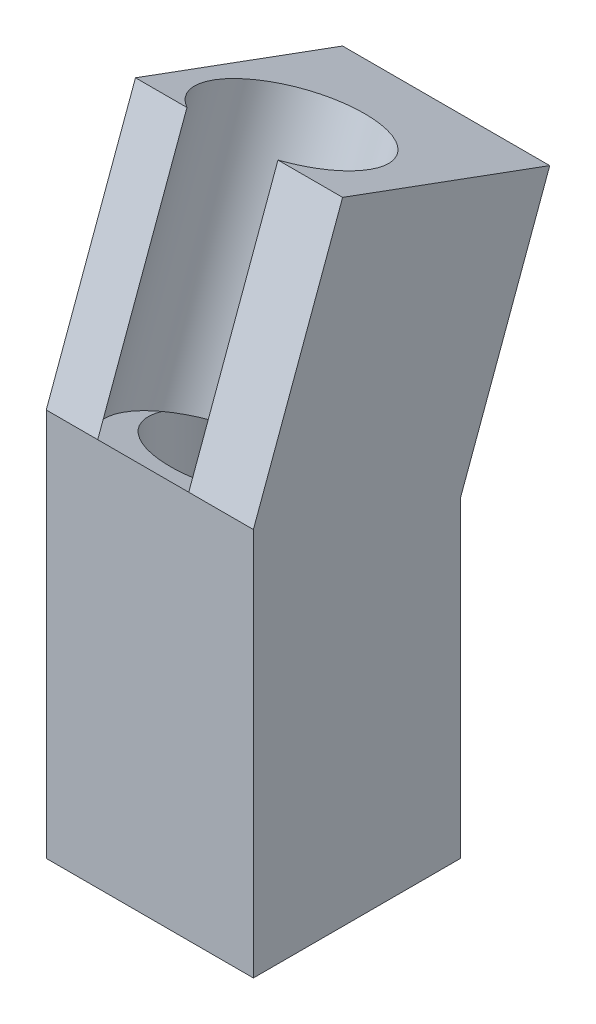
ISO-10303-21;
HEADER;
FILE_DESCRIPTION(('STEP AP214'),'2;1');
FILE_NAME('part.step','',(''),(''),'','','');
FILE_SCHEMA(('AUTOMOTIVE_DESIGN { 1 0 10303 214 1 1 1 1 }'));
ENDSEC;
DATA;
#1=APPLICATION_CONTEXT('core data for automotive mechanical design processes');
#2=APPLICATION_PROTOCOL_DEFINITION('international standard','automotive_design',2000,#1);
#3=PRODUCT_CONTEXT('',#1,'mechanical');
#4=PRODUCT('Part','Part','',(#3));
#5=PRODUCT_RELATED_PRODUCT_CATEGORY('part','',(#4));
#6=PRODUCT_DEFINITION_FORMATION('','',#4);
#7=PRODUCT_DEFINITION_CONTEXT('part definition',#1,'design');
#8=PRODUCT_DEFINITION('design','',#6,#7);
#9=PRODUCT_DEFINITION_SHAPE('','',#8);
#10=(LENGTH_UNIT() NAMED_UNIT(*) SI_UNIT(.MILLI.,.METRE.));
#11=(NAMED_UNIT(*) PLANE_ANGLE_UNIT() SI_UNIT($,.RADIAN.));
#12=(NAMED_UNIT(*) SI_UNIT($,.STERADIAN.) SOLID_ANGLE_UNIT());
#13=UNCERTAINTY_MEASURE_WITH_UNIT(LENGTH_MEASURE(1.E-05),#10,'distance_accuracy_value','');
#14=(GEOMETRIC_REPRESENTATION_CONTEXT(3) GLOBAL_UNCERTAINTY_ASSIGNED_CONTEXT((#13)) GLOBAL_UNIT_ASSIGNED_CONTEXT((#10,
#11,#12)) REPRESENTATION_CONTEXT('',''));
#15=CARTESIAN_POINT('',(0.,0.,0.));
#16=DIRECTION('',(0.,0.,1.));
#17=DIRECTION('',(1.,0.,0.));
#18=AXIS2_PLACEMENT_3D('',#15,#16,#17);
#19=CARTESIAN_POINT('',(0.,24.3874119678027,-3.44622932300727));
#20=DIRECTION('',(0.,-0.344622932300726,-0.938741196780268));
#21=DIRECTION('',(0.,0.938741196780268,-0.344622932300726));
#22=AXIS2_PLACEMENT_3D('',#19,#20,#21);
#23=PLANE('',#22);
#24=DIRECTION('',(1.,0.,0.));
#25=VECTOR('',#24,1.);
#26=CARTESIAN_POINT('',(0.,15.,0.));
#27=LINE('',#26,#25);
#28=CARTESIAN_POINT('',(0.,15.,0.));
#29=VERTEX_POINT('',#28);
#30=CARTESIAN_POINT('',(1.98807946303444,15.,0.));
#31=VERTEX_POINT('',#30);
#32=EDGE_CURVE('E116',#29,#31,#27,.T.);
#33=ORIENTED_EDGE('',*,*,#32,.T.);
#34=DIRECTION('',(0.,0.938741196780268,-0.344622932300726));
#35=VECTOR('',#34,1.);
#36=CARTESIAN_POINT('',(1.98807946303444,15.,0.));
#37=LINE('',#36,#35);
#38=CARTESIAN_POINT('',(1.98807946303444,24.3874119678027,-3.44622932300727));
#39=VERTEX_POINT('',#38);
#40=EDGE_CURVE('E129',#31,#39,#37,.T.);
#41=ORIENTED_EDGE('',*,*,#40,.T.);
#42=DIRECTION('',(1.,0.,0.));
#43=VECTOR('',#42,1.);
#44=CARTESIAN_POINT('',(0.,24.3874119678027,-3.44622932300727));
#45=LINE('',#44,#43);
#46=CARTESIAN_POINT('',(0.,24.3874119678027,-3.44622932300727));
#47=VERTEX_POINT('',#46);
#48=EDGE_CURVE('E188',#47,#39,#45,.T.);
#49=ORIENTED_EDGE('',*,*,#48,.F.);
#50=DIRECTION('',(0.,-0.938741196780268,0.344622932300726));
#51=VECTOR('',#50,1.);
#52=CARTESIAN_POINT('',(0.,24.3874119678027,-3.44622932300727));
#53=LINE('',#52,#51);
#54=EDGE_CURVE('E176',#47,#29,#53,.T.);
#55=ORIENTED_EDGE('',*,*,#54,.T.);
#56=EDGE_LOOP('',(#33,#41,#49,#55));
#57=FACE_BOUND('',#56,.T.);
#58=ADVANCED_FACE('F37',(#57),#23,.F.);
#59=CARTESIAN_POINT('',(0.,0.,0.));
#60=DIRECTION('',(0.,-1.,0.));
#61=DIRECTION('',(0.,0.,-1.));
#62=AXIS2_PLACEMENT_3D('',#59,#60,#61);
#63=PLANE('',#62);
#64=DIRECTION('',(0.,0.,1.));
#65=VECTOR('',#64,1.);
#66=CARTESIAN_POINT('',(0.,0.,0.));
#67=LINE('',#66,#65);
#68=CARTESIAN_POINT('',(0.,0.,-8.));
#69=VERTEX_POINT('',#68);
#70=CARTESIAN_POINT('',(0.,0.,0.));
#71=VERTEX_POINT('',#70);
#72=EDGE_CURVE('E165',#69,#71,#67,.T.);
#73=ORIENTED_EDGE('',*,*,#72,.F.);
#74=DIRECTION('',(-1.,0.,0.));
#75=VECTOR('',#74,1.);
#76=CARTESIAN_POINT('',(0.,0.,-8.));
#77=LINE('',#76,#75);
#78=CARTESIAN_POINT('',(8.,0.,-8.));
#79=VERTEX_POINT('',#78);
#80=EDGE_CURVE('E134',#79,#69,#77,.T.);
#81=ORIENTED_EDGE('',*,*,#80,.F.);
#82=DIRECTION('',(0.,0.,-1.));
#83=VECTOR('',#82,1.);
#84=CARTESIAN_POINT('',(8.,0.,0.));
#85=LINE('',#84,#83);
#86=CARTESIAN_POINT('',(8.,0.,0.));
#87=VERTEX_POINT('',#86);
#88=EDGE_CURVE('E136',#87,#79,#85,.T.);
#89=ORIENTED_EDGE('',*,*,#88,.F.);
#90=DIRECTION('',(1.,0.,0.));
#91=VECTOR('',#90,1.);
#92=CARTESIAN_POINT('',(0.,0.,0.));
#93=LINE('',#92,#91);
#94=EDGE_CURVE('E164',#71,#87,#93,.T.);
#95=ORIENTED_EDGE('',*,*,#94,.F.);
#96=EDGE_LOOP('',(#73,#81,#89,#95));
#97=FACE_BOUND('',#96,.T.);
#98=CARTESIAN_POINT('',(3.99556486753257,0.,-3.79143326371917));
#99=DIRECTION('',(0.,1.,0.));
#100=DIRECTION('',(0.,0.,1.));
#101=AXIS2_PLACEMENT_3D('',#98,#99,#100);
#102=CIRCLE('',#101,3.);
#103=CARTESIAN_POINT('',(3.99556486753257,0.,-0.791433263719172));
#104=VERTEX_POINT('',#103);
#105=EDGE_CURVE('E167',#104,#104,#102,.T.);
#106=ORIENTED_EDGE('',*,*,#105,.T.);
#107=EDGE_LOOP('',(#106));
#108=FACE_BOUND('',#107,.T.);
#109=ADVANCED_FACE('F162',(#97,#108),#63,.T.);
#110=CARTESIAN_POINT('',(0.,15.,0.));
#111=DIRECTION('',(1.,0.,0.));
#112=DIRECTION('',(0.,0.,-1.));
#113=AXIS2_PLACEMENT_3D('',#110,#111,#112);
#114=PLANE('',#113);
#115=DIRECTION('',(0.,-1.,0.));
#116=VECTOR('',#115,1.);
#117=CARTESIAN_POINT('',(0.,15.,0.));
#118=LINE('',#117,#116);
#119=EDGE_CURVE('E11',#29,#71,#118,.T.);
#120=ORIENTED_EDGE('',*,*,#119,.F.);
#121=ORIENTED_EDGE('',*,*,#54,.F.);
#122=DIRECTION('',(0.,0.344622932300726,0.938741196780268));
#123=VECTOR('',#122,1.);
#124=CARTESIAN_POINT('',(0.,21.4505178932038,-11.4462293230073));
#125=LINE('',#124,#123);
#126=CARTESIAN_POINT('',(0.,21.4505178932038,-11.4462293230073));
#127=VERTEX_POINT('',#126);
#128=EDGE_CURVE('E191',#127,#47,#125,.T.);
#129=ORIENTED_EDGE('',*,*,#128,.F.);
#130=DIRECTION('',(0.,-0.938741196780268,0.344622932300726));
#131=VECTOR('',#130,1.);
#132=CARTESIAN_POINT('',(0.,21.4505178932038,-11.4462293230073));
#133=LINE('',#132,#131);
#134=CARTESIAN_POINT('',(0.,12.0631059254011,-8.));
#135=VERTEX_POINT('',#134);
#136=EDGE_CURVE('E182',#127,#135,#133,.T.);
#137=ORIENTED_EDGE('',*,*,#136,.T.);
#138=DIRECTION('',(0.,-1.,0.));
#139=VECTOR('',#138,1.);
#140=CARTESIAN_POINT('',(0.,15.,-8.));
#141=LINE('',#140,#139);
#142=EDGE_CURVE('E140',#135,#69,#141,.T.);
#143=ORIENTED_EDGE('',*,*,#142,.T.);
#144=ORIENTED_EDGE('',*,*,#72,.T.);
#145=EDGE_LOOP('',(#120,#121,#129,#137,#143,#144));
#146=FACE_BOUND('',#145,.T.);
#147=ADVANCED_FACE('F39',(#146),#114,.F.);
#148=CARTESIAN_POINT('',(0.,15.,0.));
#149=DIRECTION('',(0.,0.,-1.));
#150=DIRECTION('',(-1.,0.,0.));
#151=AXIS2_PLACEMENT_3D('',#148,#149,#150);
#152=PLANE('',#151);
#153=ORIENTED_EDGE('',*,*,#94,.T.);
#154=DIRECTION('',(0.,-1.,0.));
#155=VECTOR('',#154,1.);
#156=CARTESIAN_POINT('',(8.,15.,0.));
#157=LINE('',#156,#155);
#158=CARTESIAN_POINT('',(8.,15.,0.));
#159=VERTEX_POINT('',#158);
#160=EDGE_CURVE('E46',#159,#87,#157,.T.);
#161=ORIENTED_EDGE('',*,*,#160,.F.);
#162=CARTESIAN_POINT('',(5.5029776175875,15.,0.));
#163=VERTEX_POINT('',#162);
#164=EDGE_CURVE('E117',#163,#159,#27,.T.);
#165=ORIENTED_EDGE('',*,*,#164,.F.);
#166=EDGE_CURVE('E109',#31,#163,#27,.T.);
#167=ORIENTED_EDGE('',*,*,#166,.F.);
#168=ORIENTED_EDGE('',*,*,#32,.F.);
#169=ORIENTED_EDGE('',*,*,#119,.T.);
#170=EDGE_LOOP('',(#153,#161,#165,#167,#168,#169));
#171=FACE_BOUND('',#170,.T.);
#172=ADVANCED_FACE('F131',(#171),#152,.F.);
#173=CARTESIAN_POINT('',(8.,15.,0.));
#174=DIRECTION('',(-1.,0.,0.));
#175=DIRECTION('',(0.,0.,1.));
#176=AXIS2_PLACEMENT_3D('',#173,#174,#175);
#177=PLANE('',#176);
#178=DIRECTION('',(0.,-1.,0.));
#179=VECTOR('',#178,1.);
#180=CARTESIAN_POINT('',(8.,15.,-8.));
#181=LINE('',#180,#179);
#182=CARTESIAN_POINT('',(8.,12.0631059254011,-8.));
#183=VERTEX_POINT('',#182);
#184=EDGE_CURVE('E144',#183,#79,#181,.T.);
#185=ORIENTED_EDGE('',*,*,#184,.F.);
#186=DIRECTION('',(0.,-0.938741196780268,0.344622932300726));
#187=VECTOR('',#186,1.);
#188=CARTESIAN_POINT('',(8.,21.4505178932038,-11.4462293230073));
#189=LINE('',#188,#187);
#190=CARTESIAN_POINT('',(8.,21.4505178932038,-11.4462293230073));
#191=VERTEX_POINT('',#190);
#192=EDGE_CURVE('E179',#191,#183,#189,.T.);
#193=ORIENTED_EDGE('',*,*,#192,.F.);
#194=DIRECTION('',(0.,-0.344622932300726,-0.938741196780268));
#195=VECTOR('',#194,1.);
#196=CARTESIAN_POINT('',(8.,21.4505178932038,-11.4462293230073));
#197=LINE('',#196,#195);
#198=CARTESIAN_POINT('',(8.,24.3874119678027,-3.44622932300727));
#199=VERTEX_POINT('',#198);
#200=EDGE_CURVE('E186',#199,#191,#197,.T.);
#201=ORIENTED_EDGE('',*,*,#200,.F.);
#202=DIRECTION('',(0.,-0.938741196780268,0.344622932300726));
#203=VECTOR('',#202,1.);
#204=CARTESIAN_POINT('',(8.,24.3874119678027,-3.44622932300727));
#205=LINE('',#204,#203);
#206=EDGE_CURVE('E159',#199,#159,#205,.T.);
#207=ORIENTED_EDGE('',*,*,#206,.T.);
#208=ORIENTED_EDGE('',*,*,#160,.T.);
#209=ORIENTED_EDGE('',*,*,#88,.T.);
#210=EDGE_LOOP('',(#185,#193,#201,#207,#208,#209));
#211=FACE_BOUND('',#210,.T.);
#212=ADVANCED_FACE('F156',(#211),#177,.F.);
#213=CARTESIAN_POINT('',(0.,15.,-8.));
#214=DIRECTION('',(0.,0.,1.));
#215=DIRECTION('',(1.,0.,0.));
#216=AXIS2_PLACEMENT_3D('',#213,#214,#215);
#217=PLANE('',#216);
#218=ORIENTED_EDGE('',*,*,#142,.F.);
#219=DIRECTION('',(-1.,0.,0.));
#220=VECTOR('',#219,1.);
#221=CARTESIAN_POINT('',(8.,12.0631059254011,-8.));
#222=LINE('',#221,#220);
#223=EDGE_CURVE('E173',#183,#135,#222,.T.);
#224=ORIENTED_EDGE('',*,*,#223,.F.);
#225=ORIENTED_EDGE('',*,*,#184,.T.);
#226=ORIENTED_EDGE('',*,*,#80,.T.);
#227=EDGE_LOOP('',(#218,#224,#225,#226));
#228=FACE_BOUND('',#227,.T.);
#229=ADVANCED_FACE('F204',(#228),#217,.F.);
#230=CARTESIAN_POINT('',(3.99556486753257,15.,-3.79143326371917));
#231=DIRECTION('',(0.,-1.,0.));
#232=DIRECTION('',(0.,0.,-1.));
#233=AXIS2_PLACEMENT_3D('',#230,#231,#232);
#234=CYLINDRICAL_SURFACE('',#233,3.);
#235=CARTESIAN_POINT('',(3.99556486753257,13.6081202641933,-3.79143326371917));
#236=DIRECTION('',(0.,-0.938741196780268,0.344622932300726));
#237=DIRECTION('',(0.,-0.344622932300726,-0.938741196780268));
#238=AXIS2_PLACEMENT_3D('',#235,#236,#237);
#239=ELLIPSE('',#238,3.19576898328264,3.);
#240=CARTESIAN_POINT('',(6.73096663172663,14.0603651776947,-2.55953343481394));
#241=VERTEX_POINT('',#240);
#242=CARTESIAN_POINT('',(1.01514576930289,13.7337465298738,-3.44923157039405));
#243=VERTEX_POINT('',#242);
#244=EDGE_CURVE('E41',#241,#243,#239,.T.);
#245=ORIENTED_EDGE('',*,*,#244,.F.);
#246=EDGE_CURVE('E171',#243,#241,#239,.T.);
#247=ORIENTED_EDGE('',*,*,#246,.F.);
#248=EDGE_LOOP('',(#245,#247));
#249=FACE_BOUND('',#248,.T.);
#250=ORIENTED_EDGE('',*,*,#105,.F.);
#251=EDGE_LOOP('',(#250));
#252=FACE_BOUND('',#251,.T.);
#253=ADVANCED_FACE('F201',(#249,#252),#234,.F.);
#254=CARTESIAN_POINT('',(0.,13.2185255179867,-4.85267615858864));
#255=DIRECTION('',(0.,0.938741196780268,-0.344622932300726));
#256=DIRECTION('',(0.,0.344622932300726,0.938741196780268));
#257=AXIS2_PLACEMENT_3D('',#254,#255,#256);
#258=PLANE('',#257);
#259=ORIENTED_EDGE('',*,*,#246,.T.);
#260=CARTESIAN_POINT('',(3.74552854031097,14.1621074177291,-2.28239101850568));
#261=DIRECTION('',(0.,0.938741196780268,-0.344622932300726));
#262=DIRECTION('',(0.,0.344622932300726,0.938741196780268));
#263=AXIS2_PLACEMENT_3D('',#260,#261,#262);
#264=CIRCLE('',#263,3.);
#265=EDGE_CURVE('E121',#241,#243,#264,.T.);
#266=ORIENTED_EDGE('',*,*,#265,.T.);
#267=EDGE_LOOP('',(#259,#266));
#268=FACE_BOUND('',#267,.T.);
#269=ADVANCED_FACE('F198',(#268),#258,.F.);
#270=CARTESIAN_POINT('',(5.5029776175875,24.3874119678027,-3.44622932300727));
#271=VERTEX_POINT('',#270);
#272=EDGE_CURVE('E128',#271,#199,#45,.T.);
#273=ORIENTED_EDGE('',*,*,#272,.F.);
#274=DIRECTION('',(0.,0.938741196780268,-0.344622932300726));
#275=VECTOR('',#274,1.);
#276=CARTESIAN_POINT('',(5.5029776175875,15.,0.));
#277=LINE('',#276,#275);
#278=EDGE_CURVE('E60',#271,#163,#277,.F.);
#279=ORIENTED_EDGE('',*,*,#278,.T.);
#280=ORIENTED_EDGE('',*,*,#164,.T.);
#281=ORIENTED_EDGE('',*,*,#206,.F.);
#282=EDGE_LOOP('',(#273,#279,#280,#281));
#283=FACE_BOUND('',#282,.T.);
#284=ADVANCED_FACE('F125',(#283),#23,.F.);
#285=CARTESIAN_POINT('',(0.,21.4505178932038,-11.4462293230073));
#286=DIRECTION('',(0.,0.344622932300726,0.938741196780268));
#287=DIRECTION('',(0.,-0.938741196780268,0.344622932300726));
#288=AXIS2_PLACEMENT_3D('',#285,#286,#287);
#289=PLANE('',#288);
#290=ORIENTED_EDGE('',*,*,#223,.T.);
#291=ORIENTED_EDGE('',*,*,#136,.F.);
#292=DIRECTION('',(-1.,0.,0.));
#293=VECTOR('',#292,1.);
#294=CARTESIAN_POINT('',(0.,21.4505178932038,-11.4462293230073));
#295=LINE('',#294,#293);
#296=EDGE_CURVE('E184',#191,#127,#295,.T.);
#297=ORIENTED_EDGE('',*,*,#296,.F.);
#298=ORIENTED_EDGE('',*,*,#192,.T.);
#299=EDGE_LOOP('',(#290,#291,#297,#298));
#300=FACE_BOUND('',#299,.T.);
#301=ADVANCED_FACE('F221',(#300),#289,.F.);
#302=CARTESIAN_POINT('',(0.,22.6059374857894,-8.2989054815959));
#303=DIRECTION('',(0.,0.938741196780268,-0.344622932300726));
#304=DIRECTION('',(0.,0.344622932300726,0.938741196780268));
#305=AXIS2_PLACEMENT_3D('',#302,#303,#304);
#306=PLANE('',#305);
#307=CARTESIAN_POINT('',(3.74552854031097,23.5495193855318,-5.72862034151294));
#308=DIRECTION('',(0.,0.938741196780268,-0.344622932300726));
#309=DIRECTION('',(0.,0.344622932300726,0.938741196780268));
#310=AXIS2_PLACEMENT_3D('',#307,#308,#309);
#311=CIRCLE('',#310,3.);
#312=EDGE_CURVE('E195',#271,#39,#311,.T.);
#313=ORIENTED_EDGE('',*,*,#312,.F.);
#314=ORIENTED_EDGE('',*,*,#272,.T.);
#315=ORIENTED_EDGE('',*,*,#200,.T.);
#316=ORIENTED_EDGE('',*,*,#296,.T.);
#317=ORIENTED_EDGE('',*,*,#128,.T.);
#318=ORIENTED_EDGE('',*,*,#48,.T.);
#319=EDGE_LOOP('',(#313,#314,#315,#316,#317,#318));
#320=FACE_BOUND('',#319,.T.);
#321=ADVANCED_FACE('F225',(#320),#306,.T.);
#322=CARTESIAN_POINT('',(3.74552854031097,14.1621074177291,-2.28239101850568));
#323=DIRECTION('',(0.,0.938741196780268,-0.344622932300726));
#324=DIRECTION('',(0.,0.344622932300726,0.938741196780268));
#325=AXIS2_PLACEMENT_3D('',#322,#323,#324);
#326=PLANE('',#325);
#327=ORIENTED_EDGE('',*,*,#244,.T.);
#328=EDGE_CURVE('E53',#243,#31,#264,.T.);
#329=ORIENTED_EDGE('',*,*,#328,.T.);
#330=ORIENTED_EDGE('',*,*,#166,.T.);
#331=EDGE_CURVE('E111',#163,#241,#264,.T.);
#332=ORIENTED_EDGE('',*,*,#331,.T.);
#333=EDGE_LOOP('',(#327,#329,#330,#332));
#334=FACE_BOUND('',#333,.T.);
#335=ADVANCED_FACE('F110',(#334),#326,.T.);
#336=CARTESIAN_POINT('',(3.74552854031097,14.1621074177291,-2.28239101850568));
#337=DIRECTION('',(0.,0.938741196780268,-0.344622932300726));
#338=DIRECTION('',(0.,0.344622932300726,0.938741196780268));
#339=AXIS2_PLACEMENT_3D('',#336,#337,#338);
#340=CYLINDRICAL_SURFACE('',#339,3.);
#341=ORIENTED_EDGE('',*,*,#328,.F.);
#342=ORIENTED_EDGE('',*,*,#265,.F.);
#343=ORIENTED_EDGE('',*,*,#331,.F.);
#344=ORIENTED_EDGE('',*,*,#278,.F.);
#345=ORIENTED_EDGE('',*,*,#312,.T.);
#346=ORIENTED_EDGE('',*,*,#40,.F.);
#347=EDGE_LOOP('',(#341,#342,#343,#344,#345,#346));
#348=FACE_BOUND('',#347,.T.);
#349=ADVANCED_FACE('F119',(#348),#340,.F.);
#350=CLOSED_SHELL('',(#58,#109,#147,#172,#212,#229,#253,#269,#284,#301,#321,#335,#349));
#351=MANIFOLD_SOLID_BREP('B2',#350);
#352=ADVANCED_BREP_SHAPE_REPRESENTATION('',(#18,#351),#14);
#353=SHAPE_DEFINITION_REPRESENTATION(#9,#352);
ENDSEC;
END-ISO-10303-21;
